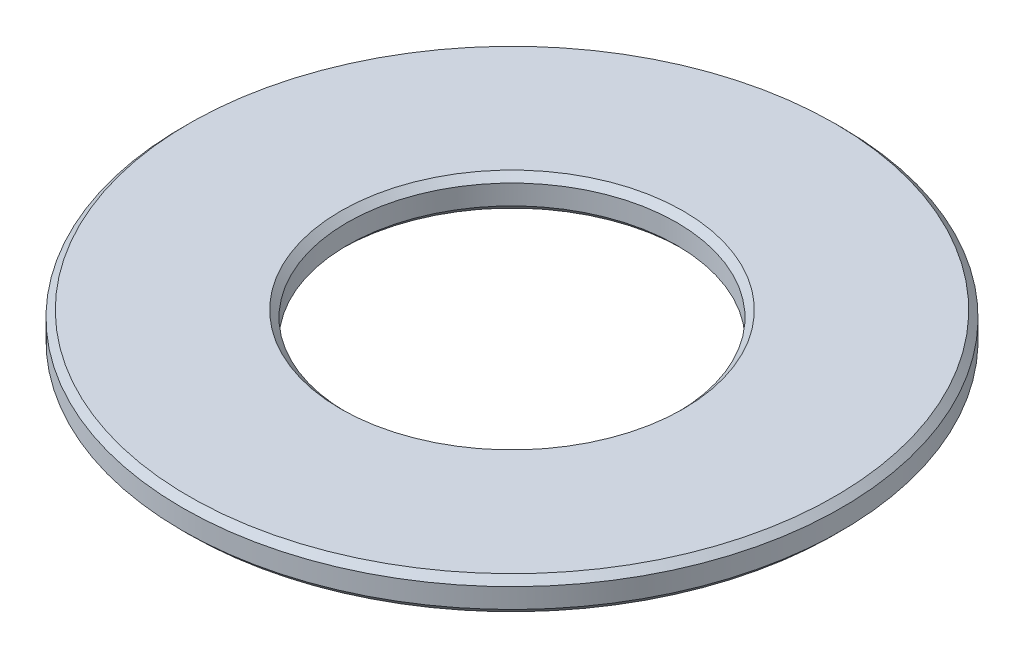
ISO-10303-21;
HEADER;
FILE_DESCRIPTION(('STEP AP214'),'2;1');
FILE_NAME('part.step','',(''),(''),'','','');
FILE_SCHEMA(('AUTOMOTIVE_DESIGN { 1 0 10303 214 1 1 1 1 }'));
ENDSEC;
DATA;
#1=APPLICATION_CONTEXT('core data for automotive mechanical design processes');
#2=APPLICATION_PROTOCOL_DEFINITION('international standard','automotive_design',2000,#1);
#3=PRODUCT_CONTEXT('',#1,'mechanical');
#4=PRODUCT('Part','Part','',(#3));
#5=PRODUCT_RELATED_PRODUCT_CATEGORY('part','',(#4));
#6=PRODUCT_DEFINITION_FORMATION('','',#4);
#7=PRODUCT_DEFINITION_CONTEXT('part definition',#1,'design');
#8=PRODUCT_DEFINITION('design','',#6,#7);
#9=PRODUCT_DEFINITION_SHAPE('','',#8);
#10=(LENGTH_UNIT() NAMED_UNIT(*) SI_UNIT(.MILLI.,.METRE.));
#11=(NAMED_UNIT(*) PLANE_ANGLE_UNIT() SI_UNIT($,.RADIAN.));
#12=(NAMED_UNIT(*) SI_UNIT($,.STERADIAN.) SOLID_ANGLE_UNIT());
#13=UNCERTAINTY_MEASURE_WITH_UNIT(LENGTH_MEASURE(1.E-05),#10,'distance_accuracy_value','');
#14=(GEOMETRIC_REPRESENTATION_CONTEXT(3) GLOBAL_UNCERTAINTY_ASSIGNED_CONTEXT((#13)) GLOBAL_UNIT_ASSIGNED_CONTEXT((#10,
#11,#12)) REPRESENTATION_CONTEXT('',''));
#15=CARTESIAN_POINT('',(0.,0.,0.));
#16=DIRECTION('',(0.,0.,1.));
#17=DIRECTION('',(1.,0.,0.));
#18=AXIS2_PLACEMENT_3D('',#15,#16,#17);
#19=CARTESIAN_POINT('',(0.,0.5,0.));
#20=DIRECTION('',(0.,1.,0.));
#21=DIRECTION('',(0.,0.,1.));
#22=AXIS2_PLACEMENT_3D('',#19,#20,#21);
#23=PLANE('',#22);
#24=CARTESIAN_POINT('',(0.,0.5,0.));
#25=DIRECTION('',(0.,1.,0.));
#26=DIRECTION('',(0.,0.,1.));
#27=AXIS2_PLACEMENT_3D('',#24,#25,#26);
#28=CIRCLE('',#27,5.2);
#29=CARTESIAN_POINT('',(0.,0.5,5.2));
#30=VERTEX_POINT('',#29);
#31=EDGE_CURVE('E47',#30,#30,#28,.F.);
#32=ORIENTED_EDGE('',*,*,#31,.T.);
#33=EDGE_LOOP('',(#32));
#34=FACE_BOUND('',#33,.T.);
#35=CARTESIAN_POINT('',(0.,0.5,0.));
#36=DIRECTION('',(0.,1.,0.));
#37=DIRECTION('',(0.,0.,1.));
#38=AXIS2_PLACEMENT_3D('',#35,#36,#37);
#39=CIRCLE('',#38,9.80000000000001);
#40=CARTESIAN_POINT('',(0.,0.5,-9.80000000000001));
#41=VERTEX_POINT('',#40);
#42=EDGE_CURVE('E51',#41,#41,#39,.T.);
#43=ORIENTED_EDGE('',*,*,#42,.T.);
#44=EDGE_LOOP('',(#43));
#45=FACE_BOUND('',#44,.T.);
#46=ADVANCED_FACE('F35',(#34,#45),#23,.T.);
#47=CARTESIAN_POINT('',(0.,-0.5,0.));
#48=DIRECTION('',(0.,1.,0.));
#49=DIRECTION('',(0.,0.,1.));
#50=AXIS2_PLACEMENT_3D('',#47,#48,#49);
#51=PLANE('',#50);
#52=CARTESIAN_POINT('',(0.,-0.5,0.));
#53=DIRECTION('',(0.,1.,0.));
#54=DIRECTION('',(0.,0.,1.));
#55=AXIS2_PLACEMENT_3D('',#52,#53,#54);
#56=CIRCLE('',#55,5.2);
#57=CARTESIAN_POINT('',(0.,-0.5,-5.2));
#58=VERTEX_POINT('',#57);
#59=EDGE_CURVE('E62',#58,#58,#56,.T.);
#60=ORIENTED_EDGE('',*,*,#59,.T.);
#61=EDGE_LOOP('',(#60));
#62=FACE_BOUND('',#61,.T.);
#63=CARTESIAN_POINT('',(0.,-0.5,0.));
#64=DIRECTION('',(0.,1.,0.));
#65=DIRECTION('',(0.,0.,1.));
#66=AXIS2_PLACEMENT_3D('',#63,#64,#65);
#67=CIRCLE('',#66,9.8);
#68=CARTESIAN_POINT('',(0.,-0.5,9.8));
#69=VERTEX_POINT('',#68);
#70=EDGE_CURVE('E65',#69,#69,#67,.F.);
#71=ORIENTED_EDGE('',*,*,#70,.T.);
#72=EDGE_LOOP('',(#71));
#73=FACE_BOUND('',#72,.T.);
#74=ADVANCED_FACE('F69',(#62,#73),#51,.F.);
#75=CARTESIAN_POINT('',(0.,0.5,0.));
#76=DIRECTION('',(0.,-1.,0.));
#77=DIRECTION('',(0.,0.,-1.));
#78=AXIS2_PLACEMENT_3D('',#75,#76,#77);
#79=CYLINDRICAL_SURFACE('',#78,10.);
#80=CARTESIAN_POINT('',(0.,-0.300000000000003,0.));
#81=DIRECTION('',(0.,1.,0.));
#82=DIRECTION('',(0.,0.,1.));
#83=AXIS2_PLACEMENT_3D('',#80,#81,#82);
#84=CIRCLE('',#83,10.);
#85=CARTESIAN_POINT('',(0.,-0.300000000000003,10.));
#86=VERTEX_POINT('',#85);
#87=EDGE_CURVE('E10',#86,#86,#84,.T.);
#88=ORIENTED_EDGE('',*,*,#87,.T.);
#89=EDGE_LOOP('',(#88));
#90=FACE_BOUND('',#89,.T.);
#91=CARTESIAN_POINT('',(0.,0.300000000000006,0.));
#92=DIRECTION('',(0.,1.,0.));
#93=DIRECTION('',(0.,0.,1.));
#94=AXIS2_PLACEMENT_3D('',#91,#92,#93);
#95=CIRCLE('',#94,10.);
#96=CARTESIAN_POINT('',(0.,0.300000000000006,-10.));
#97=VERTEX_POINT('',#96);
#98=EDGE_CURVE('E43',#97,#97,#95,.F.);
#99=ORIENTED_EDGE('',*,*,#98,.T.);
#100=EDGE_LOOP('',(#99));
#101=FACE_BOUND('',#100,.T.);
#102=ADVANCED_FACE('F90',(#90,#101),#79,.T.);
#103=CARTESIAN_POINT('',(0.,0.5,0.));
#104=DIRECTION('',(0.,-1.,0.));
#105=DIRECTION('',(0.,0.,-1.));
#106=AXIS2_PLACEMENT_3D('',#103,#104,#105);
#107=CYLINDRICAL_SURFACE('',#106,5.);
#108=CARTESIAN_POINT('',(0.,-0.3,0.));
#109=DIRECTION('',(0.,1.,0.));
#110=DIRECTION('',(0.,0.,1.));
#111=AXIS2_PLACEMENT_3D('',#108,#109,#110);
#112=CIRCLE('',#111,5.);
#113=CARTESIAN_POINT('',(0.,-0.3,-5.));
#114=VERTEX_POINT('',#113);
#115=EDGE_CURVE('E56',#114,#114,#112,.F.);
#116=ORIENTED_EDGE('',*,*,#115,.T.);
#117=EDGE_LOOP('',(#116));
#118=FACE_BOUND('',#117,.T.);
#119=CARTESIAN_POINT('',(0.,0.300000000000001,0.));
#120=DIRECTION('',(0.,1.,0.));
#121=DIRECTION('',(0.,0.,1.));
#122=AXIS2_PLACEMENT_3D('',#119,#120,#121);
#123=CIRCLE('',#122,5.);
#124=CARTESIAN_POINT('',(0.,0.300000000000001,5.));
#125=VERTEX_POINT('',#124);
#126=EDGE_CURVE('E59',#125,#125,#123,.T.);
#127=ORIENTED_EDGE('',*,*,#126,.T.);
#128=EDGE_LOOP('',(#127));
#129=FACE_BOUND('',#128,.T.);
#130=ADVANCED_FACE('F95',(#118,#129),#107,.F.);
#131=CARTESIAN_POINT('',(0.,-0.5,0.));
#132=DIRECTION('',(0.,-1.,0.));
#133=DIRECTION('',(0.,0.,-1.));
#134=AXIS2_PLACEMENT_3D('',#131,#132,#133);
#135=CONICAL_SURFACE('',#134,5.2,0.785398163397446);
#136=CARTESIAN_POINT('',(0.,-0.3,-5.));
#137=CARTESIAN_POINT('',(0.,-0.302083333333334,-5.00208333333333));
#138=CARTESIAN_POINT('',(0.,-0.304166666666667,-5.00416666666667));
#139=CARTESIAN_POINT('',(0.,-0.308333333333334,-5.00833333333333));
#140=CARTESIAN_POINT('',(0.,-0.310416666666667,-5.01041666666667));
#141=CARTESIAN_POINT('',(0.,-0.314583333333334,-5.01458333333333));
#142=CARTESIAN_POINT('',(0.,-0.316666666666667,-5.01666666666667));
#143=CARTESIAN_POINT('',(0.,-0.320833333333334,-5.02083333333333));
#144=CARTESIAN_POINT('',(0.,-0.322916666666667,-5.02291666666667));
#145=CARTESIAN_POINT('',(0.,-0.327083333333334,-5.02708333333333));
#146=CARTESIAN_POINT('',(0.,-0.329166666666667,-5.02916666666667));
#147=CARTESIAN_POINT('',(0.,-0.333333333333334,-5.03333333333333));
#148=CARTESIAN_POINT('',(0.,-0.335416666666667,-5.03541666666667));
#149=CARTESIAN_POINT('',(0.,-0.339583333333334,-5.03958333333333));
#150=CARTESIAN_POINT('',(0.,-0.341666666666667,-5.04166666666667));
#151=CARTESIAN_POINT('',(0.,-0.345833333333334,-5.04583333333333));
#152=CARTESIAN_POINT('',(0.,-0.347916666666667,-5.04791666666667));
#153=CARTESIAN_POINT('',(0.,-0.352083333333334,-5.05208333333333));
#154=CARTESIAN_POINT('',(0.,-0.354166666666667,-5.05416666666667));
#155=CARTESIAN_POINT('',(0.,-0.358333333333334,-5.05833333333333));
#156=CARTESIAN_POINT('',(0.,-0.360416666666667,-5.06041666666667));
#157=CARTESIAN_POINT('',(0.,-0.364583333333334,-5.06458333333333));
#158=CARTESIAN_POINT('',(0.,-0.366666666666667,-5.06666666666667));
#159=CARTESIAN_POINT('',(0.,-0.370833333333334,-5.07083333333333));
#160=CARTESIAN_POINT('',(0.,-0.372916666666667,-5.07291666666667));
#161=CARTESIAN_POINT('',(0.,-0.377083333333334,-5.07708333333333));
#162=CARTESIAN_POINT('',(0.,-0.379166666666667,-5.07916666666667));
#163=CARTESIAN_POINT('',(0.,-0.383333333333334,-5.08333333333333));
#164=CARTESIAN_POINT('',(0.,-0.385416666666667,-5.08541666666667));
#165=CARTESIAN_POINT('',(0.,-0.389583333333334,-5.08958333333333));
#166=CARTESIAN_POINT('',(0.,-0.391666666666667,-5.09166666666667));
#167=CARTESIAN_POINT('',(0.,-0.395833333333334,-5.09583333333333));
#168=CARTESIAN_POINT('',(0.,-0.397916666666667,-5.09791666666667));
#169=CARTESIAN_POINT('',(0.,-0.402083333333334,-5.10208333333333));
#170=CARTESIAN_POINT('',(0.,-0.404166666666667,-5.10416666666667));
#171=CARTESIAN_POINT('',(0.,-0.408333333333333,-5.10833333333333));
#172=CARTESIAN_POINT('',(0.,-0.410416666666667,-5.11041666666667));
#173=CARTESIAN_POINT('',(0.,-0.414583333333333,-5.11458333333333));
#174=CARTESIAN_POINT('',(0.,-0.416666666666667,-5.11666666666667));
#175=CARTESIAN_POINT('',(0.,-0.420833333333334,-5.12083333333333));
#176=CARTESIAN_POINT('',(0.,-0.422916666666667,-5.12291666666667));
#177=CARTESIAN_POINT('',(0.,-0.427083333333334,-5.12708333333333));
#178=CARTESIAN_POINT('',(0.,-0.429166666666667,-5.12916666666667));
#179=CARTESIAN_POINT('',(0.,-0.433333333333333,-5.13333333333333));
#180=CARTESIAN_POINT('',(0.,-0.435416666666667,-5.13541666666667));
#181=CARTESIAN_POINT('',(0.,-0.439583333333333,-5.13958333333333));
#182=CARTESIAN_POINT('',(0.,-0.441666666666667,-5.14166666666666));
#183=CARTESIAN_POINT('',(0.,-0.445833333333334,-5.14583333333333));
#184=CARTESIAN_POINT('',(0.,-0.447916666666667,-5.14791666666667));
#185=CARTESIAN_POINT('',(0.,-0.452083333333333,-5.15208333333333));
#186=CARTESIAN_POINT('',(0.,-0.454166666666667,-5.15416666666667));
#187=CARTESIAN_POINT('',(0.,-0.458333333333333,-5.15833333333333));
#188=CARTESIAN_POINT('',(0.,-0.460416666666667,-5.16041666666667));
#189=CARTESIAN_POINT('',(0.,-0.464583333333333,-5.16458333333333));
#190=CARTESIAN_POINT('',(0.,-0.466666666666667,-5.16666666666667));
#191=CARTESIAN_POINT('',(0.,-0.470833333333334,-5.17083333333333));
#192=CARTESIAN_POINT('',(0.,-0.472916666666667,-5.17291666666666));
#193=CARTESIAN_POINT('',(0.,-0.477083333333333,-5.17708333333333));
#194=CARTESIAN_POINT('',(0.,-0.479166666666667,-5.17916666666667));
#195=CARTESIAN_POINT('',(0.,-0.483333333333333,-5.18333333333333));
#196=CARTESIAN_POINT('',(0.,-0.485416666666667,-5.18541666666667));
#197=CARTESIAN_POINT('',(0.,-0.489583333333333,-5.18958333333333));
#198=CARTESIAN_POINT('',(0.,-0.491666666666667,-5.19166666666666));
#199=CARTESIAN_POINT('',(0.,-0.495833333333333,-5.19583333333333));
#200=CARTESIAN_POINT('',(0.,-0.497916666666667,-5.19791666666666));
#201=CARTESIAN_POINT('',(0.,-0.5,-5.2));
#202=B_SPLINE_CURVE_WITH_KNOTS('',3,(#136,#137,#138,#139,#140,#141,#142,#143,#144,#145,#146,
#147,#148,#149,#150,#151,#152,#153,#154,#155,#156,#157,#158,#159,#160,#161,#162,#163,#164,#165,
#166,#167,#168,#169,#170,#171,#172,#173,#174,#175,#176,#177,#178,#179,#180,#181,#182,#183,#184,
#185,#186,#187,#188,#189,#190,#191,#192,#193,#194,#195,#196,#197,#198,#199,#200,#201),
.UNSPECIFIED.,.F.,.F.,(4,2,2,2,2,2,2,2,2,2,2,2,2,2,2,2,2,2,2,2,2,2,2,2,2,2,2,2,2,2,2,2,4),(0.,
0.00883883476483198,0.017677669529664,0.0265165042944953,0.0353553390593272,0.0441941738241592,
0.0530330085889912,0.0618718433538225,0.0707106781186545,0.0795495128834865,0.0883883476483184,
0.0972271824131498,0.106066017177982,0.114904851942814,0.123743686707646,0.132582521472477,
0.141421356237309,0.150260191002141,0.159099025766973,0.167937860531804,0.176776695296636,
0.185615530061468,0.1944543648263,0.203293199591132,0.212132034355964,0.220970869120796,
0.229809703885627,0.238648538650459,0.247487373415291,0.256326208180123,0.265165042944955,
0.274003877709786,0.282842712474618),.UNSPECIFIED.);
#203=EDGE_CURVE('BSEAM80',#114,#58,#202,.T.);
#204=ORIENTED_EDGE('',*,*,#115,.F.);
#205=ORIENTED_EDGE('',*,*,#59,.F.);
#206=ORIENTED_EDGE('',*,*,#203,.T.);
#207=ORIENTED_EDGE('',*,*,#203,.F.);
#208=EDGE_LOOP('',(#204,#206,#205,#207));
#209=FACE_BOUND('',#208,.T.);
#210=ADVANCED_FACE('F80',(#209),#135,.F.);
#211=CARTESIAN_POINT('',(0.,0.300000000000001,0.));
#212=DIRECTION('',(0.,1.,0.));
#213=DIRECTION('',(0.,0.,1.));
#214=AXIS2_PLACEMENT_3D('',#211,#212,#213);
#215=CONICAL_SURFACE('',#214,5.,0.785398163397453);
#216=ORIENTED_EDGE('',*,*,#31,.F.);
#217=EDGE_LOOP('',(#216));
#218=FACE_BOUND('',#217,.T.);
#219=ORIENTED_EDGE('',*,*,#126,.F.);
#220=EDGE_LOOP('',(#219));
#221=FACE_BOUND('',#220,.T.);
#222=ADVANCED_FACE('F74',(#218,#221),#215,.F.);
#223=CARTESIAN_POINT('',(0.,-0.300000000000003,0.));
#224=DIRECTION('',(0.,1.,0.));
#225=DIRECTION('',(0.,0.,1.));
#226=AXIS2_PLACEMENT_3D('',#223,#224,#225);
#227=CONICAL_SURFACE('',#226,10.,0.785398163397453);
#228=ORIENTED_EDGE('',*,*,#70,.F.);
#229=EDGE_LOOP('',(#228));
#230=FACE_BOUND('',#229,.T.);
#231=ORIENTED_EDGE('',*,*,#87,.F.);
#232=EDGE_LOOP('',(#231));
#233=FACE_BOUND('',#232,.T.);
#234=ADVANCED_FACE('F71',(#230,#233),#227,.T.);
#235=CARTESIAN_POINT('',(0.,0.5,0.));
#236=DIRECTION('',(0.,-1.,0.));
#237=DIRECTION('',(0.,0.,-1.));
#238=AXIS2_PLACEMENT_3D('',#235,#236,#237);
#239=CONICAL_SURFACE('',#238,9.80000000000001,0.785398163397448);
#240=CARTESIAN_POINT('',(0.,0.300000000000006,-10.));
#241=CARTESIAN_POINT('',(0.,0.30208333333334,-9.99791666666667));
#242=CARTESIAN_POINT('',(0.,0.304166666666673,-9.99583333333333));
#243=CARTESIAN_POINT('',(0.,0.308333333333339,-9.99166666666667));
#244=CARTESIAN_POINT('',(0.,0.310416666666673,-9.98958333333333));
#245=CARTESIAN_POINT('',(0.,0.314583333333339,-9.98541666666667));
#246=CARTESIAN_POINT('',(0.,0.316666666666672,-9.98333333333333));
#247=CARTESIAN_POINT('',(0.,0.320833333333339,-9.97916666666667));
#248=CARTESIAN_POINT('',(0.,0.322916666666672,-9.97708333333333));
#249=CARTESIAN_POINT('',(0.,0.327083333333339,-9.97291666666667));
#250=CARTESIAN_POINT('',(0.,0.329166666666672,-9.97083333333333));
#251=CARTESIAN_POINT('',(0.,0.333333333333339,-9.96666666666667));
#252=CARTESIAN_POINT('',(0.,0.335416666666672,-9.96458333333333));
#253=CARTESIAN_POINT('',(0.,0.339583333333338,-9.96041666666667));
#254=CARTESIAN_POINT('',(0.,0.341666666666672,-9.95833333333333));
#255=CARTESIAN_POINT('',(0.,0.345833333333338,-9.95416666666667));
#256=CARTESIAN_POINT('',(0.,0.347916666666671,-9.95208333333334));
#257=CARTESIAN_POINT('',(0.,0.352083333333338,-9.94791666666667));
#258=CARTESIAN_POINT('',(0.,0.354166666666671,-9.94583333333334));
#259=CARTESIAN_POINT('',(0.,0.358333333333338,-9.94166666666667));
#260=CARTESIAN_POINT('',(0.,0.360416666666671,-9.93958333333333));
#261=CARTESIAN_POINT('',(0.,0.364583333333337,-9.93541666666667));
#262=CARTESIAN_POINT('',(0.,0.366666666666671,-9.93333333333334));
#263=CARTESIAN_POINT('',(0.,0.370833333333338,-9.92916666666667));
#264=CARTESIAN_POINT('',(0.,0.372916666666671,-9.92708333333334));
#265=CARTESIAN_POINT('',(0.,0.377083333333337,-9.92291666666667));
#266=CARTESIAN_POINT('',(0.,0.37916666666667,-9.92083333333334));
#267=CARTESIAN_POINT('',(0.,0.383333333333337,-9.91666666666667));
#268=CARTESIAN_POINT('',(0.,0.38541666666667,-9.91458333333334));
#269=CARTESIAN_POINT('',(0.,0.389583333333337,-9.91041666666667));
#270=CARTESIAN_POINT('',(0.,0.39166666666667,-9.90833333333334));
#271=CARTESIAN_POINT('',(0.,0.395833333333337,-9.90416666666667));
#272=CARTESIAN_POINT('',(0.,0.39791666666667,-9.90208333333334));
#273=CARTESIAN_POINT('',(0.,0.402083333333337,-9.89791666666667));
#274=CARTESIAN_POINT('',(0.,0.40416666666667,-9.89583333333334));
#275=CARTESIAN_POINT('',(0.,0.408333333333336,-9.89166666666667));
#276=CARTESIAN_POINT('',(0.,0.410416666666669,-9.88958333333334));
#277=CARTESIAN_POINT('',(0.,0.414583333333336,-9.88541666666667));
#278=CARTESIAN_POINT('',(0.,0.41666666666667,-9.88333333333334));
#279=CARTESIAN_POINT('',(0.,0.420833333333336,-9.87916666666667));
#280=CARTESIAN_POINT('',(0.,0.422916666666669,-9.87708333333334));
#281=CARTESIAN_POINT('',(0.,0.427083333333335,-9.87291666666667));
#282=CARTESIAN_POINT('',(0.,0.429166666666669,-9.87083333333334));
#283=CARTESIAN_POINT('',(0.,0.433333333333335,-9.86666666666667));
#284=CARTESIAN_POINT('',(0.,0.435416666666669,-9.86458333333334));
#285=CARTESIAN_POINT('',(0.,0.439583333333335,-9.86041666666667));
#286=CARTESIAN_POINT('',(0.,0.441666666666669,-9.85833333333334));
#287=CARTESIAN_POINT('',(0.,0.445833333333335,-9.85416666666667));
#288=CARTESIAN_POINT('',(0.,0.447916666666668,-9.85208333333334));
#289=CARTESIAN_POINT('',(0.,0.452083333333335,-9.84791666666667));
#290=CARTESIAN_POINT('',(0.,0.454166666666668,-9.84583333333334));
#291=CARTESIAN_POINT('',(0.,0.458333333333335,-9.84166666666667));
#292=CARTESIAN_POINT('',(0.,0.460416666666668,-9.83958333333334));
#293=CARTESIAN_POINT('',(0.,0.464583333333335,-9.83541666666667));
#294=CARTESIAN_POINT('',(0.,0.466666666666668,-9.83333333333334));
#295=CARTESIAN_POINT('',(0.,0.470833333333334,-9.82916666666667));
#296=CARTESIAN_POINT('',(0.,0.472916666666667,-9.82708333333334));
#297=CARTESIAN_POINT('',(0.,0.477083333333334,-9.82291666666667));
#298=CARTESIAN_POINT('',(0.,0.479166666666667,-9.82083333333334));
#299=CARTESIAN_POINT('',(0.,0.483333333333334,-9.81666666666667));
#300=CARTESIAN_POINT('',(0.,0.485416666666667,-9.81458333333334));
#301=CARTESIAN_POINT('',(0.,0.489583333333334,-9.81041666666667));
#302=CARTESIAN_POINT('',(0.,0.491666666666667,-9.80833333333334));
#303=CARTESIAN_POINT('',(0.,0.495833333333333,-9.80416666666667));
#304=CARTESIAN_POINT('',(0.,0.497916666666666,-9.80208333333334));
#305=CARTESIAN_POINT('',(0.,0.5,-9.80000000000001));
#306=B_SPLINE_CURVE_WITH_KNOTS('',3,(#240,#241,#242,#243,#244,#245,#246,#247,#248,#249,#250,
#251,#252,#253,#254,#255,#256,#257,#258,#259,#260,#261,#262,#263,#264,#265,#266,#267,#268,#269,
#270,#271,#272,#273,#274,#275,#276,#277,#278,#279,#280,#281,#282,#283,#284,#285,#286,#287,#288,
#289,#290,#291,#292,#293,#294,#295,#296,#297,#298,#299,#300,#301,#302,#303,#304,#305),
.UNSPECIFIED.,.F.,.F.,(4,2,2,2,2,2,2,2,2,2,2,2,2,2,2,2,2,2,2,2,2,2,2,2,2,2,2,2,2,2,2,2,4),(0.,
0.00883883476483125,0.0176776695296637,0.0265165042944949,0.0353553390593261,0.0441941738241573,
0.0530330085889897,0.061871843353821,0.0707106781186522,0.0795495128834834,0.0883883476483158,
0.0972271824131471,0.106066017177978,0.114904851942811,0.123743686707642,0.132582521472473,
0.141421356237304,0.150260191002137,0.159099025766968,0.167937860531799,0.176776695296632,
0.185615530061463,0.194454364826294,0.203293199591125,0.212132034355958,0.220970869120789,
0.22980970388562,0.238648538650453,0.247487373415284,0.256326208180115,0.265165042944946,
0.274003877709779,0.28284271247461),.UNSPECIFIED.);
#307=EDGE_CURVE('BSEAM38',#97,#41,#306,.T.);
#308=ORIENTED_EDGE('',*,*,#98,.F.);
#309=ORIENTED_EDGE('',*,*,#42,.F.);
#310=ORIENTED_EDGE('',*,*,#307,.T.);
#311=ORIENTED_EDGE('',*,*,#307,.F.);
#312=EDGE_LOOP('',(#308,#310,#309,#311));
#313=FACE_BOUND('',#312,.T.);
#314=ADVANCED_FACE('F38',(#313),#239,.T.);
#315=CLOSED_SHELL('',(#46,#74,#102,#130,#210,#222,#234,#314));
#316=MANIFOLD_SOLID_BREP('B2',#315);
#317=ADVANCED_BREP_SHAPE_REPRESENTATION('',(#18,#316),#14);
#318=SHAPE_DEFINITION_REPRESENTATION(#9,#317);
ENDSEC;
END-ISO-10303-21;
